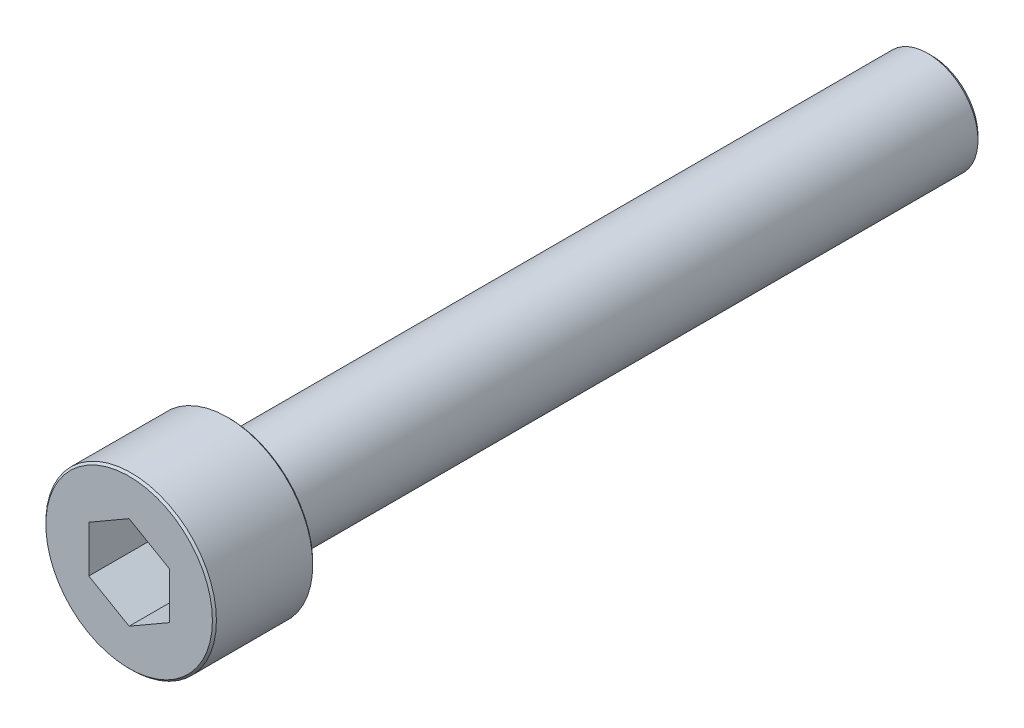
ISO-10303-21;
HEADER;
FILE_DESCRIPTION(('STEP AP214'),'2;1');
FILE_NAME('part.step','',(''),(''),'','','');
FILE_SCHEMA(('AUTOMOTIVE_DESIGN { 1 0 10303 214 1 1 1 1 }'));
ENDSEC;
DATA;
#1=APPLICATION_CONTEXT('core data for automotive mechanical design processes');
#2=APPLICATION_PROTOCOL_DEFINITION('international standard','automotive_design',2000,#1);
#3=PRODUCT_CONTEXT('',#1,'mechanical');
#4=PRODUCT('Part','Part','',(#3));
#5=PRODUCT_RELATED_PRODUCT_CATEGORY('part','',(#4));
#6=PRODUCT_DEFINITION_FORMATION('','',#4);
#7=PRODUCT_DEFINITION_CONTEXT('part definition',#1,'design');
#8=PRODUCT_DEFINITION('design','',#6,#7);
#9=PRODUCT_DEFINITION_SHAPE('','',#8);
#10=(LENGTH_UNIT() NAMED_UNIT(*) SI_UNIT(.MILLI.,.METRE.));
#11=(NAMED_UNIT(*) PLANE_ANGLE_UNIT() SI_UNIT($,.RADIAN.));
#12=(NAMED_UNIT(*) SI_UNIT($,.STERADIAN.) SOLID_ANGLE_UNIT());
#13=UNCERTAINTY_MEASURE_WITH_UNIT(LENGTH_MEASURE(1.E-05),#10,'distance_accuracy_value','');
#14=(GEOMETRIC_REPRESENTATION_CONTEXT(3) GLOBAL_UNCERTAINTY_ASSIGNED_CONTEXT((#13)) GLOBAL_UNIT_ASSIGNED_CONTEXT((#10,
#11,#12)) REPRESENTATION_CONTEXT('',''));
#15=CARTESIAN_POINT('',(0.,0.,0.));
#16=DIRECTION('',(0.,0.,1.));
#17=DIRECTION('',(1.,0.,0.));
#18=AXIS2_PLACEMENT_3D('',#15,#16,#17);
#19=CARTESIAN_POINT('',(0.,0.,35.));
#20=DIRECTION('',(0.,0.,1.));
#21=DIRECTION('',(1.,0.,0.));
#22=AXIS2_PLACEMENT_3D('',#19,#20,#21);
#23=CYLINDRICAL_SURFACE('',#22,4.25);
#24=CARTESIAN_POINT('',(0.,0.,35.1000131246164));
#25=DIRECTION('',(0.,0.,-1.));
#26=DIRECTION('',(-1.,0.,0.));
#27=AXIS2_PLACEMENT_3D('',#24,#25,#26);
#28=CIRCLE('',#27,4.25);
#29=CARTESIAN_POINT('',(-4.25,0.,35.1000131246164));
#30=VERTEX_POINT('',#29);
#31=EDGE_CURVE('E153',#30,#30,#28,.F.);
#32=ORIENTED_EDGE('',*,*,#31,.T.);
#33=EDGE_LOOP('',(#32));
#34=FACE_BOUND('',#33,.T.);
#35=CARTESIAN_POINT('',(0.,0.,39.8999865590187));
#36=DIRECTION('',(0.,0.,1.));
#37=DIRECTION('',(1.,0.,0.));
#38=AXIS2_PLACEMENT_3D('',#35,#36,#37);
#39=CIRCLE('',#38,4.25);
#40=CARTESIAN_POINT('',(4.25,0.,39.8999865590187));
#41=VERTEX_POINT('',#40);
#42=EDGE_CURVE('E150',#41,#41,#39,.F.);
#43=ORIENTED_EDGE('',*,*,#42,.T.);
#44=EDGE_LOOP('',(#43));
#45=FACE_BOUND('',#44,.T.);
#46=ADVANCED_FACE('F39',(#34,#45),#23,.T.);
#47=CARTESIAN_POINT('',(4.25,0.,35.));
#48=DIRECTION('',(0.,0.,-1.));
#49=DIRECTION('',(-1.,0.,0.));
#50=AXIS2_PLACEMENT_3D('',#47,#48,#49);
#51=PLANE('',#50);
#52=CARTESIAN_POINT('',(0.,0.,35.));
#53=DIRECTION('',(0.,0.,-1.));
#54=DIRECTION('',(-1.,0.,0.));
#55=AXIS2_PLACEMENT_3D('',#52,#53,#54);
#56=CIRCLE('',#55,4.14998655901865);
#57=CARTESIAN_POINT('',(-4.14998655901865,0.,35.));
#58=VERTEX_POINT('',#57);
#59=EDGE_CURVE('E156',#58,#58,#56,.T.);
#60=ORIENTED_EDGE('',*,*,#59,.T.);
#61=EDGE_LOOP('',(#60));
#62=FACE_BOUND('',#61,.T.);
#63=CARTESIAN_POINT('',(0.,0.,35.));
#64=DIRECTION('',(0.,0.,-1.));
#65=DIRECTION('',(-1.,0.,0.));
#66=AXIS2_PLACEMENT_3D('',#63,#64,#65);
#67=CIRCLE('',#66,2.5);
#68=CARTESIAN_POINT('',(-2.5,0.,35.));
#69=VERTEX_POINT('',#68);
#70=EDGE_CURVE('E142',#69,#69,#67,.T.);
#71=ORIENTED_EDGE('',*,*,#70,.F.);
#72=EDGE_LOOP('',(#71));
#73=FACE_BOUND('',#72,.T.);
#74=ADVANCED_FACE('F176',(#62,#73),#51,.T.);
#75=CARTESIAN_POINT('',(0.,0.,40.));
#76=DIRECTION('',(0.,0.,1.));
#77=DIRECTION('',(1.,0.,0.));
#78=AXIS2_PLACEMENT_3D('',#75,#76,#77);
#79=PLANE('',#78);
#80=CARTESIAN_POINT('',(0.,0.,40.));
#81=DIRECTION('',(0.,0.,1.));
#82=DIRECTION('',(1.,0.,0.));
#83=AXIS2_PLACEMENT_3D('',#80,#81,#82);
#84=CIRCLE('',#83,4.14998687538364);
#85=CARTESIAN_POINT('',(4.14998687538364,0.,40.));
#86=VERTEX_POINT('',#85);
#87=EDGE_CURVE('E159',#86,#86,#84,.T.);
#88=ORIENTED_EDGE('',*,*,#87,.T.);
#89=EDGE_LOOP('',(#88));
#90=FACE_BOUND('',#89,.T.);
#91=DIRECTION('',(0.,-1.,0.));
#92=VECTOR('',#91,1.);
#93=CARTESIAN_POINT('',(-2.00999999999998,1.16047404107096,40.));
#94=LINE('',#93,#92);
#95=CARTESIAN_POINT('',(-2.00999999999998,1.16047404107096,40.));
#96=VERTEX_POINT('',#95);
#97=CARTESIAN_POINT('',(-2.01,-1.160474041071,40.));
#98=VERTEX_POINT('',#97);
#99=EDGE_CURVE('E55',#96,#98,#94,.T.);
#100=ORIENTED_EDGE('',*,*,#99,.F.);
#101=DIRECTION('',(-0.866025403784436,-0.500000000000004,0.));
#102=VECTOR('',#101,1.);
#103=CARTESIAN_POINT('',(0.,2.32094808214212,40.));
#104=LINE('',#103,#102);
#105=CARTESIAN_POINT('',(0.,2.32094808214212,40.));
#106=VERTEX_POINT('',#105);
#107=EDGE_CURVE('E138',#106,#96,#104,.T.);
#108=ORIENTED_EDGE('',*,*,#107,.F.);
#109=DIRECTION('',(-0.866025403784428,0.500000000000018,0.));
#110=VECTOR('',#109,1.);
#111=CARTESIAN_POINT('',(2.0099999999999,1.16047404107098,40.));
#112=LINE('',#111,#110);
#113=CARTESIAN_POINT('',(2.0099999999999,1.16047404107098,40.));
#114=VERTEX_POINT('',#113);
#115=EDGE_CURVE('E136',#114,#106,#112,.T.);
#116=ORIENTED_EDGE('',*,*,#115,.F.);
#117=DIRECTION('',(0.,1.,0.));
#118=VECTOR('',#117,1.);
#119=CARTESIAN_POINT('',(2.0099999999999,-1.16047404107098,40.));
#120=LINE('',#119,#118);
#121=CARTESIAN_POINT('',(2.0099999999999,-1.16047404107098,40.));
#122=VERTEX_POINT('',#121);
#123=EDGE_CURVE('E103',#122,#114,#120,.T.);
#124=ORIENTED_EDGE('',*,*,#123,.F.);
#125=DIRECTION('',(0.866025403784439,0.5,0.));
#126=VECTOR('',#125,1.);
#127=CARTESIAN_POINT('',(0.,-2.32094808214211,40.));
#128=LINE('',#127,#126);
#129=CARTESIAN_POINT('',(0.,-2.32094808214211,40.));
#130=VERTEX_POINT('',#129);
#131=EDGE_CURVE('E132',#130,#122,#128,.T.);
#132=ORIENTED_EDGE('',*,*,#131,.F.);
#133=DIRECTION('',(0.866025403784439,-0.5,0.));
#134=VECTOR('',#133,1.);
#135=CARTESIAN_POINT('',(-2.01,-1.160474041071,40.));
#136=LINE('',#135,#134);
#137=EDGE_CURVE('E129',#98,#130,#136,.T.);
#138=ORIENTED_EDGE('',*,*,#137,.F.);
#139=EDGE_LOOP('',(#100,#108,#116,#124,#132,#138));
#140=FACE_BOUND('',#139,.T.);
#141=ADVANCED_FACE('F182',(#90,#140),#79,.T.);
#142=CARTESIAN_POINT('',(0.,0.,0.));
#143=DIRECTION('',(0.,0.,1.));
#144=DIRECTION('',(1.,0.,0.));
#145=AXIS2_PLACEMENT_3D('',#142,#143,#144);
#146=CYLINDRICAL_SURFACE('',#145,2.5);
#147=CARTESIAN_POINT('',(0.,0.,0.200061516521085));
#148=DIRECTION('',(0.,0.,-1.));
#149=DIRECTION('',(-1.,0.,0.));
#150=AXIS2_PLACEMENT_3D('',#147,#148,#149);
#151=CIRCLE('',#150,2.5);
#152=CARTESIAN_POINT('',(2.5,0.,0.200061516521085));
#153=VERTEX_POINT('',#152);
#154=EDGE_CURVE('E11',#153,#153,#151,.F.);
#155=ORIENTED_EDGE('',*,*,#154,.T.);
#156=EDGE_LOOP('',(#155));
#157=FACE_BOUND('',#156,.T.);
#158=ORIENTED_EDGE('',*,*,#70,.T.);
#159=EDGE_LOOP('',(#158));
#160=FACE_BOUND('',#159,.T.);
#161=ADVANCED_FACE('F209',(#157,#160),#146,.T.);
#162=CARTESIAN_POINT('',(0.,0.,0.));
#163=DIRECTION('',(0.,0.,-1.));
#164=DIRECTION('',(-1.,0.,0.));
#165=AXIS2_PLACEMENT_3D('',#162,#163,#164);
#166=PLANE('',#165);
#167=CARTESIAN_POINT('',(0.,0.,0.));
#168=DIRECTION('',(0.,0.,-1.));
#169=DIRECTION('',(-1.,0.,0.));
#170=AXIS2_PLACEMENT_3D('',#167,#168,#169);
#171=CIRCLE('',#170,2.29994340622814);
#172=CARTESIAN_POINT('',(2.29994340622814,0.,0.));
#173=VERTEX_POINT('',#172);
#174=EDGE_CURVE('E48',#173,#173,#171,.T.);
#175=ORIENTED_EDGE('',*,*,#174,.T.);
#176=EDGE_LOOP('',(#175));
#177=FACE_BOUND('',#176,.T.);
#178=ADVANCED_FACE('F164',(#177),#166,.T.);
#179=CARTESIAN_POINT('',(-2.00999999999998,1.16047404107096,36.25));
#180=DIRECTION('',(-1.,0.,0.));
#181=DIRECTION('',(0.,-1.,0.));
#182=AXIS2_PLACEMENT_3D('',#179,#180,#181);
#183=PLANE('',#182);
#184=ORIENTED_EDGE('',*,*,#99,.T.);
#185=DIRECTION('',(0.,0.,1.));
#186=VECTOR('',#185,1.);
#187=CARTESIAN_POINT('',(-2.01,-1.160474041071,36.25));
#188=LINE('',#187,#186);
#189=CARTESIAN_POINT('',(-2.01,-1.160474041071,36.25));
#190=VERTEX_POINT('',#189);
#191=EDGE_CURVE('E85',#190,#98,#188,.T.);
#192=ORIENTED_EDGE('',*,*,#191,.F.);
#193=DIRECTION('',(0.,-1.,0.));
#194=VECTOR('',#193,1.);
#195=CARTESIAN_POINT('',(-2.00999999999998,1.16047404107096,36.25));
#196=LINE('',#195,#194);
#197=CARTESIAN_POINT('',(-2.00999999999998,1.16047404107096,36.25));
#198=VERTEX_POINT('',#197);
#199=EDGE_CURVE('E140',#198,#190,#196,.T.);
#200=ORIENTED_EDGE('',*,*,#199,.F.);
#201=DIRECTION('',(0.,0.,1.));
#202=VECTOR('',#201,1.);
#203=CARTESIAN_POINT('',(-2.00999999999998,1.16047404107096,36.25));
#204=LINE('',#203,#202);
#205=EDGE_CURVE('E63',#198,#96,#204,.T.);
#206=ORIENTED_EDGE('',*,*,#205,.T.);
#207=EDGE_LOOP('',(#184,#192,#200,#206));
#208=FACE_BOUND('',#207,.T.);
#209=ADVANCED_FACE('F217',(#208),#183,.F.);
#210=CARTESIAN_POINT('',(0.,2.32094808214212,36.25));
#211=DIRECTION('',(-0.500000000000004,0.866025403784436,0.));
#212=DIRECTION('',(-0.866025403784436,-0.500000000000004,0.));
#213=AXIS2_PLACEMENT_3D('',#210,#211,#212);
#214=PLANE('',#213);
#215=ORIENTED_EDGE('',*,*,#107,.T.);
#216=ORIENTED_EDGE('',*,*,#205,.F.);
#217=DIRECTION('',(-0.866025403784436,-0.500000000000004,0.));
#218=VECTOR('',#217,1.);
#219=CARTESIAN_POINT('',(0.,2.32094808214212,36.25));
#220=LINE('',#219,#218);
#221=CARTESIAN_POINT('',(0.,2.32094808214212,36.25));
#222=VERTEX_POINT('',#221);
#223=EDGE_CURVE('E115',#222,#198,#220,.T.);
#224=ORIENTED_EDGE('',*,*,#223,.F.);
#225=DIRECTION('',(0.,0.,1.));
#226=VECTOR('',#225,1.);
#227=CARTESIAN_POINT('',(0.,2.32094808214212,36.25));
#228=LINE('',#227,#226);
#229=EDGE_CURVE('E107',#222,#106,#228,.T.);
#230=ORIENTED_EDGE('',*,*,#229,.T.);
#231=EDGE_LOOP('',(#215,#216,#224,#230));
#232=FACE_BOUND('',#231,.T.);
#233=ADVANCED_FACE('F223',(#232),#214,.F.);
#234=CARTESIAN_POINT('',(2.0099999999999,1.16047404107098,36.25));
#235=DIRECTION('',(0.500000000000018,0.866025403784428,0.));
#236=DIRECTION('',(-0.866025403784428,0.500000000000018,0.));
#237=AXIS2_PLACEMENT_3D('',#234,#235,#236);
#238=PLANE('',#237);
#239=ORIENTED_EDGE('',*,*,#115,.T.);
#240=ORIENTED_EDGE('',*,*,#229,.F.);
#241=DIRECTION('',(-0.866025403784428,0.500000000000018,0.));
#242=VECTOR('',#241,1.);
#243=CARTESIAN_POINT('',(2.0099999999999,1.16047404107098,36.25));
#244=LINE('',#243,#242);
#245=CARTESIAN_POINT('',(2.0099999999999,1.16047404107098,36.25));
#246=VERTEX_POINT('',#245);
#247=EDGE_CURVE('E111',#246,#222,#244,.T.);
#248=ORIENTED_EDGE('',*,*,#247,.F.);
#249=DIRECTION('',(0.,0.,1.));
#250=VECTOR('',#249,1.);
#251=CARTESIAN_POINT('',(2.0099999999999,1.16047404107098,36.25));
#252=LINE('',#251,#250);
#253=EDGE_CURVE('E96',#246,#114,#252,.T.);
#254=ORIENTED_EDGE('',*,*,#253,.T.);
#255=EDGE_LOOP('',(#239,#240,#248,#254));
#256=FACE_BOUND('',#255,.T.);
#257=ADVANCED_FACE('F112',(#256),#238,.F.);
#258=CARTESIAN_POINT('',(2.0099999999999,-1.16047404107098,36.25));
#259=DIRECTION('',(1.,0.,0.));
#260=DIRECTION('',(0.,0.,-1.));
#261=AXIS2_PLACEMENT_3D('',#258,#259,#260);
#262=PLANE('',#261);
#263=ORIENTED_EDGE('',*,*,#123,.T.);
#264=ORIENTED_EDGE('',*,*,#253,.F.);
#265=DIRECTION('',(0.,1.,0.));
#266=VECTOR('',#265,1.);
#267=CARTESIAN_POINT('',(2.0099999999999,-1.16047404107098,36.25));
#268=LINE('',#267,#266);
#269=CARTESIAN_POINT('',(2.0099999999999,-1.16047404107098,36.25));
#270=VERTEX_POINT('',#269);
#271=EDGE_CURVE('E100',#270,#246,#268,.T.);
#272=ORIENTED_EDGE('',*,*,#271,.F.);
#273=DIRECTION('',(0.,0.,1.));
#274=VECTOR('',#273,1.);
#275=CARTESIAN_POINT('',(2.0099999999999,-1.16047404107098,36.25));
#276=LINE('',#275,#274);
#277=EDGE_CURVE('E108',#270,#122,#276,.T.);
#278=ORIENTED_EDGE('',*,*,#277,.T.);
#279=EDGE_LOOP('',(#263,#264,#272,#278));
#280=FACE_BOUND('',#279,.T.);
#281=ADVANCED_FACE('F98',(#280),#262,.F.);
#282=CARTESIAN_POINT('',(0.,-2.32094808214211,36.25));
#283=DIRECTION('',(0.5,-0.866025403784439,0.));
#284=DIRECTION('',(0.866025403784439,0.5,0.));
#285=AXIS2_PLACEMENT_3D('',#282,#283,#284);
#286=PLANE('',#285);
#287=ORIENTED_EDGE('',*,*,#131,.T.);
#288=ORIENTED_EDGE('',*,*,#277,.F.);
#289=DIRECTION('',(0.866025403784439,0.5,0.));
#290=VECTOR('',#289,1.);
#291=CARTESIAN_POINT('',(0.,-2.32094808214211,36.25));
#292=LINE('',#291,#290);
#293=CARTESIAN_POINT('',(0.,-2.32094808214211,36.25));
#294=VERTEX_POINT('',#293);
#295=EDGE_CURVE('E121',#294,#270,#292,.T.);
#296=ORIENTED_EDGE('',*,*,#295,.F.);
#297=DIRECTION('',(0.,0.,1.));
#298=VECTOR('',#297,1.);
#299=CARTESIAN_POINT('',(0.,-2.32094808214211,36.25));
#300=LINE('',#299,#298);
#301=EDGE_CURVE('E145',#294,#130,#300,.T.);
#302=ORIENTED_EDGE('',*,*,#301,.T.);
#303=EDGE_LOOP('',(#287,#288,#296,#302));
#304=FACE_BOUND('',#303,.T.);
#305=ADVANCED_FACE('F226',(#304),#286,.F.);
#306=CARTESIAN_POINT('',(-2.01,-1.160474041071,36.25));
#307=DIRECTION('',(-0.5,-0.866025403784439,0.));
#308=DIRECTION('',(0.866025403784439,-0.5,0.));
#309=AXIS2_PLACEMENT_3D('',#306,#307,#308);
#310=PLANE('',#309);
#311=ORIENTED_EDGE('',*,*,#137,.T.);
#312=ORIENTED_EDGE('',*,*,#301,.F.);
#313=DIRECTION('',(0.866025403784439,-0.5,0.));
#314=VECTOR('',#313,1.);
#315=CARTESIAN_POINT('',(-2.01,-1.160474041071,36.25));
#316=LINE('',#315,#314);
#317=EDGE_CURVE('E123',#190,#294,#316,.T.);
#318=ORIENTED_EDGE('',*,*,#317,.F.);
#319=ORIENTED_EDGE('',*,*,#191,.T.);
#320=EDGE_LOOP('',(#311,#312,#318,#319));
#321=FACE_BOUND('',#320,.T.);
#322=ADVANCED_FACE('F201',(#321),#310,.F.);
#323=CARTESIAN_POINT('',(0.,0.,36.25));
#324=DIRECTION('',(0.,0.,1.));
#325=DIRECTION('',(1.,0.,0.));
#326=AXIS2_PLACEMENT_3D('',#323,#324,#325);
#327=PLANE('',#326);
#328=ORIENTED_EDGE('',*,*,#199,.T.);
#329=ORIENTED_EDGE('',*,*,#317,.T.);
#330=ORIENTED_EDGE('',*,*,#295,.T.);
#331=ORIENTED_EDGE('',*,*,#271,.T.);
#332=ORIENTED_EDGE('',*,*,#247,.T.);
#333=ORIENTED_EDGE('',*,*,#223,.T.);
#334=EDGE_LOOP('',(#328,#329,#330,#331,#332,#333));
#335=FACE_BOUND('',#334,.T.);
#336=ADVANCED_FACE('F118',(#335),#327,.T.);
#337=CARTESIAN_POINT('',(0.,0.,35.1000131246164));
#338=DIRECTION('',(0.,0.,1.));
#339=DIRECTION('',(1.,0.,0.));
#340=AXIS2_PLACEMENT_3D('',#337,#338,#339);
#341=CONICAL_SURFACE('',#340,4.25,0.785399745012297);
#342=ORIENTED_EDGE('',*,*,#59,.F.);
#343=EDGE_LOOP('',(#342));
#344=FACE_BOUND('',#343,.T.);
#345=ORIENTED_EDGE('',*,*,#31,.F.);
#346=EDGE_LOOP('',(#345));
#347=FACE_BOUND('',#346,.T.);
#348=ADVANCED_FACE('F172',(#344,#347),#341,.T.);
#349=CARTESIAN_POINT('',(0.,0.,40.));
#350=DIRECTION('',(0.,0.,-1.));
#351=DIRECTION('',(-1.,0.,0.));
#352=AXIS2_PLACEMENT_3D('',#349,#350,#351);
#353=CONICAL_SURFACE('',#352,4.14998687538364,0.785396581782582);
#354=ORIENTED_EDGE('',*,*,#42,.F.);
#355=EDGE_LOOP('',(#354));
#356=FACE_BOUND('',#355,.T.);
#357=ORIENTED_EDGE('',*,*,#87,.F.);
#358=EDGE_LOOP('',(#357));
#359=FACE_BOUND('',#358,.T.);
#360=ADVANCED_FACE('F167',(#356,#359),#353,.T.);
#361=CARTESIAN_POINT('',(0.,0.,0.));
#362=DIRECTION('',(0.,0.,1.));
#363=DIRECTION('',(1.,0.,0.));
#364=AXIS2_PLACEMENT_3D('',#361,#362,#363);
#365=CONICAL_SURFACE('',#364,2.29994340622814,0.785385860157226);
#366=CARTESIAN_POINT('',(2.5,0.,0.200061516521085));
#367=CARTESIAN_POINT('',(2.49791607714821,0.,0.197977542390657));
#368=CARTESIAN_POINT('',(2.49583215429642,0.,0.195893568260229));
#369=CARTESIAN_POINT('',(2.49166430859284,0.,0.191725619999373));
#370=CARTESIAN_POINT('',(2.48958038574105,0.,0.189641645868945));
#371=CARTESIAN_POINT('',(2.48541254003747,0.,0.185473697608089));
#372=CARTESIAN_POINT('',(2.48332861718568,0.,0.183389723477661));
#373=CARTESIAN_POINT('',(2.4791607714821,0.,0.179221775216805));
#374=CARTESIAN_POINT('',(2.47707684863031,0.,0.177137801086377));
#375=CARTESIAN_POINT('',(2.47290900292673,0.,0.172969852825522));
#376=CARTESIAN_POINT('',(2.47082508007494,0.,0.170885878695094));
#377=CARTESIAN_POINT('',(2.46665723437136,0.,0.166717930434238));
#378=CARTESIAN_POINT('',(2.46457331151957,0.,0.16463395630381));
#379=CARTESIAN_POINT('',(2.46040546581599,0.,0.160466008042954));
#380=CARTESIAN_POINT('',(2.4583215429642,0.,0.158382033912526));
#381=CARTESIAN_POINT('',(2.45415369726062,0.,0.15421408565167));
#382=CARTESIAN_POINT('',(2.45206977440883,0.,0.152130111521242));
#383=CARTESIAN_POINT('',(2.44790192870525,0.,0.147962163260386));
#384=CARTESIAN_POINT('',(2.44581800585346,0.,0.145878189129958));
#385=CARTESIAN_POINT('',(2.44165016014988,0.,0.141710240869102));
#386=CARTESIAN_POINT('',(2.43956623729808,0.,0.139626266738674));
#387=CARTESIAN_POINT('',(2.4353983915945,0.,0.135458318477818));
#388=CARTESIAN_POINT('',(2.43331446874271,0.,0.13337434434739));
#389=CARTESIAN_POINT('',(2.42914662303913,0.,0.129206396086534));
#390=CARTESIAN_POINT('',(2.42706270018734,0.,0.127122421956106));
#391=CARTESIAN_POINT('',(2.42289485448376,0.,0.12295447369525));
#392=CARTESIAN_POINT('',(2.42081093163197,0.,0.120870499564822));
#393=CARTESIAN_POINT('',(2.41664308592839,0.,0.116702551303966));
#394=CARTESIAN_POINT('',(2.4145591630766,0.,0.114618577173538));
#395=CARTESIAN_POINT('',(2.41039131737302,0.,0.110450628912682));
#396=CARTESIAN_POINT('',(2.40830739452123,0.,0.108366654782254));
#397=CARTESIAN_POINT('',(2.40413954881765,0.,0.104198706521398));
#398=CARTESIAN_POINT('',(2.40205562596586,0.,0.10211473239097));
#399=CARTESIAN_POINT('',(2.39788778026228,0.,0.0979467841301146));
#400=CARTESIAN_POINT('',(2.39580385741049,0.,0.0958628099996866));
#401=CARTESIAN_POINT('',(2.39163601170691,0.,0.0916948617388307));
#402=CARTESIAN_POINT('',(2.38955208885512,0.,0.0896108876084027));
#403=CARTESIAN_POINT('',(2.38538424315154,0.,0.0854429393475468));
#404=CARTESIAN_POINT('',(2.38330032029975,0.,0.0833589652171188));
#405=CARTESIAN_POINT('',(2.37913247459617,0.,0.0791910169562629));
#406=CARTESIAN_POINT('',(2.37704855174438,0.,0.0771070428258349));
#407=CARTESIAN_POINT('',(2.3728807060408,0.,0.0729390945649789));
#408=CARTESIAN_POINT('',(2.37079678318901,0.,0.070855120434551));
#409=CARTESIAN_POINT('',(2.36662893748543,0.,0.066687172173695));
#410=CARTESIAN_POINT('',(2.36454501463364,0.,0.0646031980432671));
#411=CARTESIAN_POINT('',(2.36037716893006,0.,0.0604352497824111));
#412=CARTESIAN_POINT('',(2.35829324607827,0.,0.0583512756519832));
#413=CARTESIAN_POINT('',(2.35412540037469,0.,0.0541833273911272));
#414=CARTESIAN_POINT('',(2.3520414775229,0.,0.0520993532606992));
#415=CARTESIAN_POINT('',(2.34787363181932,0.,0.0479314049998433));
#416=CARTESIAN_POINT('',(2.34578970896753,0.,0.0458474308694153));
#417=CARTESIAN_POINT('',(2.34162186326395,0.,0.0416794826085594));
#418=CARTESIAN_POINT('',(2.33953794041216,0.,0.0395955084781314));
#419=CARTESIAN_POINT('',(2.33537009470858,0.,0.0354275602172755));
#420=CARTESIAN_POINT('',(2.33328617185679,0.,0.0333435860868475));
#421=CARTESIAN_POINT('',(2.32911832615321,0.,0.0291756378259916));
#422=CARTESIAN_POINT('',(2.32703440330142,0.,0.0270916636955636));
#423=CARTESIAN_POINT('',(2.32286655759784,0.,0.0229237154347077));
#424=CARTESIAN_POINT('',(2.32078263474605,0.,0.0208397413042797));
#425=CARTESIAN_POINT('',(2.31661478904246,0.,0.0166717930434238));
#426=CARTESIAN_POINT('',(2.31453086619067,0.,0.0145878189129958));
#427=CARTESIAN_POINT('',(2.31036302048709,0.,0.0104198706521398));
#428=CARTESIAN_POINT('',(2.3082790976353,0.,0.00833589652171188));
#429=CARTESIAN_POINT('',(2.30411125193172,0.,0.00416794826085594));
#430=CARTESIAN_POINT('',(2.30202732907993,0.,0.00208397413042797));
#431=CARTESIAN_POINT('',(2.29994340622814,0.,0.));
#432=B_SPLINE_CURVE_WITH_KNOTS('',3,(#366,#367,#368,#369,#370,#371,#372,#373,#374,#375,#376,
#377,#378,#379,#380,#381,#382,#383,#384,#385,#386,#387,#388,#389,#390,#391,#392,#393,#394,#395,
#396,#397,#398,#399,#400,#401,#402,#403,#404,#405,#406,#407,#408,#409,#410,#411,#412,#413,#414,
#415,#416,#417,#418,#419,#420,#421,#422,#423,#424,#425,#426,#427,#428,#429,#430,#431),
.UNSPECIFIED.,.F.,.F.,(4,2,2,2,2,2,2,2,2,2,2,2,2,2,2,2,2,2,2,2,2,2,2,2,2,2,2,2,2,2,2,2,4),(0.,
0.00884144465890932,0.0176828893178186,0.026524333976728,0.0353657786356373,0.0442072232945466,
0.0530486679534559,0.0618901126123656,0.0707315572712749,0.0795730019301842,0.0884144465890935,
0.0972558912480028,0.106097335906912,0.114938780565821,0.123780225224731,0.13262166988364,
0.141463114542549,0.150304559201459,0.159146003860368,0.167987448519278,0.176828893178187,
0.185670337837096,0.194511782496006,0.203353227154915,0.212194671813824,0.221036116472734,
0.229877561131643,0.238719005790553,0.247560450449462,0.256401895108371,0.26524333976728,
0.27408478442619,0.282926229085099),.UNSPECIFIED.);
#433=EDGE_CURVE('BSEAM42',#153,#173,#432,.T.);
#434=ORIENTED_EDGE('',*,*,#154,.F.);
#435=ORIENTED_EDGE('',*,*,#174,.F.);
#436=ORIENTED_EDGE('',*,*,#433,.T.);
#437=ORIENTED_EDGE('',*,*,#433,.F.);
#438=EDGE_LOOP('',(#434,#436,#435,#437));
#439=FACE_BOUND('',#438,.T.);
#440=ADVANCED_FACE('F42',(#439),#365,.T.);
#441=CLOSED_SHELL('',(#46,#74,#141,#161,#178,#209,#233,#257,#281,#305,#322,#336,#348,#360,#440));
#442=MANIFOLD_SOLID_BREP('B2',#441);
#443=ADVANCED_BREP_SHAPE_REPRESENTATION('',(#18,#442),#14);
#444=SHAPE_DEFINITION_REPRESENTATION(#9,#443);
ENDSEC;
END-ISO-10303-21;
